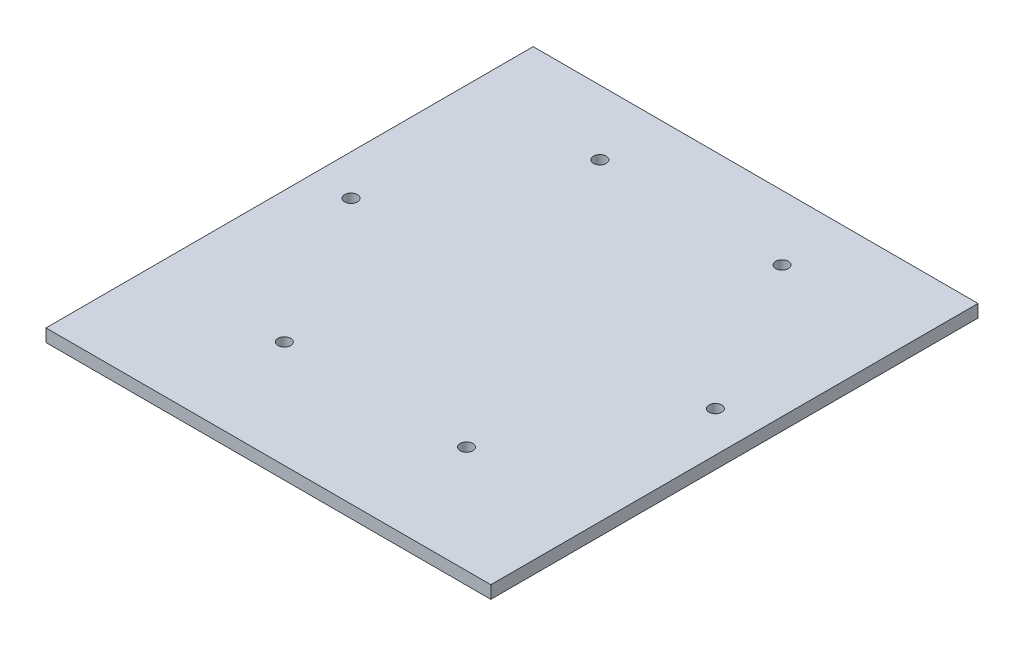
ISO-10303-21;
HEADER;
FILE_DESCRIPTION(('STEP AP214'),'2;1');
FILE_NAME('part.step','',(''),(''),'','','');
FILE_SCHEMA(('AUTOMOTIVE_DESIGN { 1 0 10303 214 1 1 1 1 }'));
ENDSEC;
DATA;
#1=APPLICATION_CONTEXT('core data for automotive mechanical design processes');
#2=APPLICATION_PROTOCOL_DEFINITION('international standard','automotive_design',2000,#1);
#3=PRODUCT_CONTEXT('',#1,'mechanical');
#4=PRODUCT('Part','Part','',(#3));
#5=PRODUCT_RELATED_PRODUCT_CATEGORY('part','',(#4));
#6=PRODUCT_DEFINITION_FORMATION('','',#4);
#7=PRODUCT_DEFINITION_CONTEXT('part definition',#1,'design');
#8=PRODUCT_DEFINITION('design','',#6,#7);
#9=PRODUCT_DEFINITION_SHAPE('','',#8);
#10=(LENGTH_UNIT() NAMED_UNIT(*) SI_UNIT(.MILLI.,.METRE.));
#11=(NAMED_UNIT(*) PLANE_ANGLE_UNIT() SI_UNIT($,.RADIAN.));
#12=(NAMED_UNIT(*) SI_UNIT($,.STERADIAN.) SOLID_ANGLE_UNIT());
#13=UNCERTAINTY_MEASURE_WITH_UNIT(LENGTH_MEASURE(1.E-05),#10,'distance_accuracy_value','');
#14=(GEOMETRIC_REPRESENTATION_CONTEXT(3) GLOBAL_UNCERTAINTY_ASSIGNED_CONTEXT((#13)) GLOBAL_UNIT_ASSIGNED_CONTEXT((#10,
#11,#12)) REPRESENTATION_CONTEXT('',''));
#15=CARTESIAN_POINT('',(0.,0.,0.));
#16=DIRECTION('',(0.,0.,1.));
#17=DIRECTION('',(1.,0.,0.));
#18=AXIS2_PLACEMENT_3D('',#15,#16,#17);
#19=CARTESIAN_POINT('',(0.,6.,0.));
#20=DIRECTION('',(0.,-1.,0.));
#21=DIRECTION('',(0.,0.,-1.));
#22=AXIS2_PLACEMENT_3D('',#19,#20,#21);
#23=PLANE('',#22);
#24=DIRECTION('',(0.,0.,1.));
#25=VECTOR('',#24,1.);
#26=CARTESIAN_POINT('',(0.,6.,0.));
#27=LINE('',#26,#25);
#28=CARTESIAN_POINT('',(0.,6.,-230.));
#29=VERTEX_POINT('',#28);
#30=CARTESIAN_POINT('',(0.,6.,0.));
#31=VERTEX_POINT('',#30);
#32=EDGE_CURVE('E84',#29,#31,#27,.T.);
#33=ORIENTED_EDGE('',*,*,#32,.T.);
#34=DIRECTION('',(1.,0.,0.));
#35=VECTOR('',#34,1.);
#36=CARTESIAN_POINT('',(0.,6.,0.));
#37=LINE('',#36,#35);
#38=CARTESIAN_POINT('',(210.,6.,0.));
#39=VERTEX_POINT('',#38);
#40=EDGE_CURVE('E79',#31,#39,#37,.T.);
#41=ORIENTED_EDGE('',*,*,#40,.T.);
#42=DIRECTION('',(0.,0.,-1.));
#43=VECTOR('',#42,1.);
#44=CARTESIAN_POINT('',(210.,6.,0.));
#45=LINE('',#44,#43);
#46=CARTESIAN_POINT('',(210.,6.,-230.));
#47=VERTEX_POINT('',#46);
#48=EDGE_CURVE('E82',#39,#47,#45,.T.);
#49=ORIENTED_EDGE('',*,*,#48,.T.);
#50=DIRECTION('',(-1.,0.,0.));
#51=VECTOR('',#50,1.);
#52=CARTESIAN_POINT('',(0.,6.,-230.));
#53=LINE('',#52,#51);
#54=EDGE_CURVE('E49',#47,#29,#53,.T.);
#55=ORIENTED_EDGE('',*,*,#54,.T.);
#56=EDGE_LOOP('',(#33,#41,#49,#55));
#57=FACE_BOUND('',#56,.T.);
#58=CARTESIAN_POINT('',(62.,6.,-199.478184725462));
#59=DIRECTION('',(0.,1.,0.));
#60=DIRECTION('',(0.,0.,1.));
#61=AXIS2_PLACEMENT_3D('',#58,#59,#60);
#62=CIRCLE('',#61,3.00000000000001);
#63=CARTESIAN_POINT('',(62.,6.,-196.478184725462));
#64=VERTEX_POINT('',#63);
#65=EDGE_CURVE('E99',#64,#64,#62,.T.);
#66=ORIENTED_EDGE('',*,*,#65,.F.);
#67=EDGE_LOOP('',(#66));
#68=FACE_BOUND('',#67,.T.);
#69=CARTESIAN_POINT('',(148.,6.,-199.478184725462));
#70=DIRECTION('',(0.,1.,0.));
#71=DIRECTION('',(0.,0.,1.));
#72=AXIS2_PLACEMENT_3D('',#69,#70,#71);
#73=CIRCLE('',#72,2.99999999999997);
#74=CARTESIAN_POINT('',(148.,6.,-196.478184725462));
#75=VERTEX_POINT('',#74);
#76=EDGE_CURVE('E114',#75,#75,#73,.T.);
#77=ORIENTED_EDGE('',*,*,#76,.F.);
#78=EDGE_LOOP('',(#77));
#79=FACE_BOUND('',#78,.T.);
#80=CARTESIAN_POINT('',(191.,6.,-125.));
#81=DIRECTION('',(0.,1.,0.));
#82=DIRECTION('',(0.,0.,1.));
#83=AXIS2_PLACEMENT_3D('',#80,#81,#82);
#84=CIRCLE('',#83,2.99999999999999);
#85=CARTESIAN_POINT('',(191.,6.,-122.));
#86=VERTEX_POINT('',#85);
#87=EDGE_CURVE('E120',#86,#86,#84,.T.);
#88=ORIENTED_EDGE('',*,*,#87,.F.);
#89=EDGE_LOOP('',(#88));
#90=FACE_BOUND('',#89,.T.);
#91=CARTESIAN_POINT('',(148.,6.,-50.5218152745383));
#92=DIRECTION('',(0.,1.,0.));
#93=DIRECTION('',(0.,0.,1.));
#94=AXIS2_PLACEMENT_3D('',#91,#92,#93);
#95=CIRCLE('',#94,2.99999999999999);
#96=CARTESIAN_POINT('',(148.,6.,-47.5218152745383));
#97=VERTEX_POINT('',#96);
#98=EDGE_CURVE('E126',#97,#97,#95,.T.);
#99=ORIENTED_EDGE('',*,*,#98,.F.);
#100=EDGE_LOOP('',(#99));
#101=FACE_BOUND('',#100,.T.);
#102=CARTESIAN_POINT('',(62.,6.,-50.5218152745383));
#103=DIRECTION('',(0.,1.,0.));
#104=DIRECTION('',(0.,0.,1.));
#105=AXIS2_PLACEMENT_3D('',#102,#103,#104);
#106=CIRCLE('',#105,2.99999999999999);
#107=CARTESIAN_POINT('',(62.,6.,-47.5218152745383));
#108=VERTEX_POINT('',#107);
#109=EDGE_CURVE('E132',#108,#108,#106,.T.);
#110=ORIENTED_EDGE('',*,*,#109,.F.);
#111=EDGE_LOOP('',(#110));
#112=FACE_BOUND('',#111,.T.);
#113=CARTESIAN_POINT('',(19.,6.,-125.));
#114=DIRECTION('',(0.,1.,0.));
#115=DIRECTION('',(0.,0.,1.));
#116=AXIS2_PLACEMENT_3D('',#113,#114,#115);
#117=CIRCLE('',#116,3.00000000000001);
#118=CARTESIAN_POINT('',(19.,6.,-122.));
#119=VERTEX_POINT('',#118);
#120=EDGE_CURVE('E138',#119,#119,#117,.T.);
#121=ORIENTED_EDGE('',*,*,#120,.F.);
#122=EDGE_LOOP('',(#121));
#123=FACE_BOUND('',#122,.T.);
#124=ADVANCED_FACE('F32',(#57,#68,#79,#90,#101,#112,#123),#23,.F.);
#125=CARTESIAN_POINT('',(0.,0.,0.));
#126=DIRECTION('',(0.,-1.,0.));
#127=DIRECTION('',(0.,0.,-1.));
#128=AXIS2_PLACEMENT_3D('',#125,#126,#127);
#129=PLANE('',#128);
#130=CARTESIAN_POINT('',(62.,0.,-50.5218152745383));
#131=DIRECTION('',(0.,1.,0.));
#132=DIRECTION('',(0.,0.,1.));
#133=AXIS2_PLACEMENT_3D('',#130,#131,#132);
#134=CIRCLE('',#133,2.99999999999999);
#135=CARTESIAN_POINT('',(62.,0.,-47.5218152745383));
#136=VERTEX_POINT('',#135);
#137=EDGE_CURVE('E135',#136,#136,#134,.T.);
#138=ORIENTED_EDGE('',*,*,#137,.T.);
#139=EDGE_LOOP('',(#138));
#140=FACE_BOUND('',#139,.T.);
#141=CARTESIAN_POINT('',(191.,0.,-125.));
#142=DIRECTION('',(0.,1.,0.));
#143=DIRECTION('',(0.,0.,1.));
#144=AXIS2_PLACEMENT_3D('',#141,#142,#143);
#145=CIRCLE('',#144,2.99999999999999);
#146=CARTESIAN_POINT('',(191.,0.,-122.));
#147=VERTEX_POINT('',#146);
#148=EDGE_CURVE('E123',#147,#147,#145,.T.);
#149=ORIENTED_EDGE('',*,*,#148,.T.);
#150=EDGE_LOOP('',(#149));
#151=FACE_BOUND('',#150,.T.);
#152=CARTESIAN_POINT('',(62.,0.,-199.478184725462));
#153=DIRECTION('',(0.,1.,0.));
#154=DIRECTION('',(0.,0.,1.));
#155=AXIS2_PLACEMENT_3D('',#152,#153,#154);
#156=CIRCLE('',#155,3.00000000000001);
#157=CARTESIAN_POINT('',(62.,0.,-196.478184725462));
#158=VERTEX_POINT('',#157);
#159=EDGE_CURVE('E111',#158,#158,#156,.T.);
#160=ORIENTED_EDGE('',*,*,#159,.T.);
#161=EDGE_LOOP('',(#160));
#162=FACE_BOUND('',#161,.T.);
#163=DIRECTION('',(0.,0.,1.));
#164=VECTOR('',#163,1.);
#165=CARTESIAN_POINT('',(0.,0.,0.));
#166=LINE('',#165,#164);
#167=CARTESIAN_POINT('',(0.,0.,-230.));
#168=VERTEX_POINT('',#167);
#169=CARTESIAN_POINT('',(0.,0.,0.));
#170=VERTEX_POINT('',#169);
#171=EDGE_CURVE('E96',#168,#170,#166,.T.);
#172=ORIENTED_EDGE('',*,*,#171,.F.);
#173=DIRECTION('',(-1.,0.,0.));
#174=VECTOR('',#173,1.);
#175=CARTESIAN_POINT('',(0.,0.,-230.));
#176=LINE('',#175,#174);
#177=CARTESIAN_POINT('',(210.,0.,-230.));
#178=VERTEX_POINT('',#177);
#179=EDGE_CURVE('E72',#178,#168,#176,.T.);
#180=ORIENTED_EDGE('',*,*,#179,.F.);
#181=DIRECTION('',(0.,0.,-1.));
#182=VECTOR('',#181,1.);
#183=CARTESIAN_POINT('',(210.,0.,0.));
#184=LINE('',#183,#182);
#185=CARTESIAN_POINT('',(210.,0.,0.));
#186=VERTEX_POINT('',#185);
#187=EDGE_CURVE('E66',#186,#178,#184,.T.);
#188=ORIENTED_EDGE('',*,*,#187,.F.);
#189=DIRECTION('',(1.,0.,0.));
#190=VECTOR('',#189,1.);
#191=CARTESIAN_POINT('',(0.,0.,0.));
#192=LINE('',#191,#190);
#193=EDGE_CURVE('E88',#170,#186,#192,.T.);
#194=ORIENTED_EDGE('',*,*,#193,.F.);
#195=EDGE_LOOP('',(#172,#180,#188,#194));
#196=FACE_BOUND('',#195,.T.);
#197=CARTESIAN_POINT('',(148.,0.,-199.478184725462));
#198=DIRECTION('',(0.,1.,0.));
#199=DIRECTION('',(0.,0.,1.));
#200=AXIS2_PLACEMENT_3D('',#197,#198,#199);
#201=CIRCLE('',#200,2.99999999999997);
#202=CARTESIAN_POINT('',(148.,0.,-196.478184725462));
#203=VERTEX_POINT('',#202);
#204=EDGE_CURVE('E117',#203,#203,#201,.T.);
#205=ORIENTED_EDGE('',*,*,#204,.T.);
#206=EDGE_LOOP('',(#205));
#207=FACE_BOUND('',#206,.T.);
#208=CARTESIAN_POINT('',(148.,0.,-50.5218152745383));
#209=DIRECTION('',(0.,1.,0.));
#210=DIRECTION('',(0.,0.,1.));
#211=AXIS2_PLACEMENT_3D('',#208,#209,#210);
#212=CIRCLE('',#211,2.99999999999999);
#213=CARTESIAN_POINT('',(148.,0.,-47.5218152745383));
#214=VERTEX_POINT('',#213);
#215=EDGE_CURVE('E129',#214,#214,#212,.T.);
#216=ORIENTED_EDGE('',*,*,#215,.T.);
#217=EDGE_LOOP('',(#216));
#218=FACE_BOUND('',#217,.T.);
#219=CARTESIAN_POINT('',(19.,0.,-125.));
#220=DIRECTION('',(0.,1.,0.));
#221=DIRECTION('',(0.,0.,1.));
#222=AXIS2_PLACEMENT_3D('',#219,#220,#221);
#223=CIRCLE('',#222,3.00000000000001);
#224=CARTESIAN_POINT('',(19.,0.,-122.));
#225=VERTEX_POINT('',#224);
#226=EDGE_CURVE('E141',#225,#225,#223,.T.);
#227=ORIENTED_EDGE('',*,*,#226,.T.);
#228=EDGE_LOOP('',(#227));
#229=FACE_BOUND('',#228,.T.);
#230=ADVANCED_FACE('F107',(#140,#151,#162,#196,#207,#218,#229),#129,.T.);
#231=CARTESIAN_POINT('',(0.,6.,0.));
#232=DIRECTION('',(1.,0.,0.));
#233=DIRECTION('',(0.,0.,-1.));
#234=AXIS2_PLACEMENT_3D('',#231,#232,#233);
#235=PLANE('',#234);
#236=ORIENTED_EDGE('',*,*,#171,.T.);
#237=DIRECTION('',(0.,-1.,0.));
#238=VECTOR('',#237,1.);
#239=CARTESIAN_POINT('',(0.,6.,0.));
#240=LINE('',#239,#238);
#241=EDGE_CURVE('E11',#31,#170,#240,.T.);
#242=ORIENTED_EDGE('',*,*,#241,.F.);
#243=ORIENTED_EDGE('',*,*,#32,.F.);
#244=DIRECTION('',(0.,-1.,0.));
#245=VECTOR('',#244,1.);
#246=CARTESIAN_POINT('',(0.,6.,-230.));
#247=LINE('',#246,#245);
#248=EDGE_CURVE('E92',#29,#168,#247,.T.);
#249=ORIENTED_EDGE('',*,*,#248,.T.);
#250=EDGE_LOOP('',(#236,#242,#243,#249));
#251=FACE_BOUND('',#250,.T.);
#252=ADVANCED_FACE('F34',(#251),#235,.F.);
#253=CARTESIAN_POINT('',(0.,6.,0.));
#254=DIRECTION('',(0.,0.,-1.));
#255=DIRECTION('',(-1.,0.,0.));
#256=AXIS2_PLACEMENT_3D('',#253,#254,#255);
#257=PLANE('',#256);
#258=ORIENTED_EDGE('',*,*,#193,.T.);
#259=DIRECTION('',(0.,-1.,0.));
#260=VECTOR('',#259,1.);
#261=CARTESIAN_POINT('',(210.,6.,0.));
#262=LINE('',#261,#260);
#263=EDGE_CURVE('E41',#39,#186,#262,.T.);
#264=ORIENTED_EDGE('',*,*,#263,.F.);
#265=ORIENTED_EDGE('',*,*,#40,.F.);
#266=ORIENTED_EDGE('',*,*,#241,.T.);
#267=EDGE_LOOP('',(#258,#264,#265,#266));
#268=FACE_BOUND('',#267,.T.);
#269=ADVANCED_FACE('F87',(#268),#257,.F.);
#270=CARTESIAN_POINT('',(210.,6.,0.));
#271=DIRECTION('',(-1.,0.,0.));
#272=DIRECTION('',(0.,0.,1.));
#273=AXIS2_PLACEMENT_3D('',#270,#271,#272);
#274=PLANE('',#273);
#275=ORIENTED_EDGE('',*,*,#187,.T.);
#276=DIRECTION('',(0.,-1.,0.));
#277=VECTOR('',#276,1.);
#278=CARTESIAN_POINT('',(210.,6.,-230.));
#279=LINE('',#278,#277);
#280=EDGE_CURVE('E89',#47,#178,#279,.T.);
#281=ORIENTED_EDGE('',*,*,#280,.F.);
#282=ORIENTED_EDGE('',*,*,#48,.F.);
#283=ORIENTED_EDGE('',*,*,#263,.T.);
#284=EDGE_LOOP('',(#275,#281,#282,#283));
#285=FACE_BOUND('',#284,.T.);
#286=ADVANCED_FACE('F90',(#285),#274,.F.);
#287=CARTESIAN_POINT('',(0.,6.,-230.));
#288=DIRECTION('',(0.,0.,1.));
#289=DIRECTION('',(1.,0.,0.));
#290=AXIS2_PLACEMENT_3D('',#287,#288,#289);
#291=PLANE('',#290);
#292=ORIENTED_EDGE('',*,*,#179,.T.);
#293=ORIENTED_EDGE('',*,*,#248,.F.);
#294=ORIENTED_EDGE('',*,*,#54,.F.);
#295=ORIENTED_EDGE('',*,*,#280,.T.);
#296=EDGE_LOOP('',(#292,#293,#294,#295));
#297=FACE_BOUND('',#296,.T.);
#298=ADVANCED_FACE('F104',(#297),#291,.F.);
#299=CARTESIAN_POINT('',(62.,6.,-199.478184725462));
#300=DIRECTION('',(0.,-1.,0.));
#301=DIRECTION('',(0.,0.,-1.));
#302=AXIS2_PLACEMENT_3D('',#299,#300,#301);
#303=CYLINDRICAL_SURFACE('',#302,3.00000000000001);
#304=ORIENTED_EDGE('',*,*,#65,.T.);
#305=EDGE_LOOP('',(#304));
#306=FACE_BOUND('',#305,.T.);
#307=ORIENTED_EDGE('',*,*,#159,.F.);
#308=EDGE_LOOP('',(#307));
#309=FACE_BOUND('',#308,.T.);
#310=ADVANCED_FACE('F158',(#306,#309),#303,.F.);
#311=CARTESIAN_POINT('',(148.,6.,-199.478184725462));
#312=DIRECTION('',(0.,-1.,0.));
#313=DIRECTION('',(0.,0.,-1.));
#314=AXIS2_PLACEMENT_3D('',#311,#312,#313);
#315=CYLINDRICAL_SURFACE('',#314,2.99999999999997);
#316=ORIENTED_EDGE('',*,*,#76,.T.);
#317=EDGE_LOOP('',(#316));
#318=FACE_BOUND('',#317,.T.);
#319=ORIENTED_EDGE('',*,*,#204,.F.);
#320=EDGE_LOOP('',(#319));
#321=FACE_BOUND('',#320,.T.);
#322=ADVANCED_FACE('F204',(#318,#321),#315,.F.);
#323=CARTESIAN_POINT('',(191.,6.,-125.));
#324=DIRECTION('',(0.,-1.,0.));
#325=DIRECTION('',(0.,0.,-1.));
#326=AXIS2_PLACEMENT_3D('',#323,#324,#325);
#327=CYLINDRICAL_SURFACE('',#326,2.99999999999999);
#328=ORIENTED_EDGE('',*,*,#87,.T.);
#329=EDGE_LOOP('',(#328));
#330=FACE_BOUND('',#329,.T.);
#331=ORIENTED_EDGE('',*,*,#148,.F.);
#332=EDGE_LOOP('',(#331));
#333=FACE_BOUND('',#332,.T.);
#334=ADVANCED_FACE('F212',(#330,#333),#327,.F.);
#335=CARTESIAN_POINT('',(148.,6.,-50.5218152745383));
#336=DIRECTION('',(0.,-1.,0.));
#337=DIRECTION('',(0.,0.,-1.));
#338=AXIS2_PLACEMENT_3D('',#335,#336,#337);
#339=CYLINDRICAL_SURFACE('',#338,2.99999999999999);
#340=ORIENTED_EDGE('',*,*,#98,.T.);
#341=EDGE_LOOP('',(#340));
#342=FACE_BOUND('',#341,.T.);
#343=ORIENTED_EDGE('',*,*,#215,.F.);
#344=EDGE_LOOP('',(#343));
#345=FACE_BOUND('',#344,.T.);
#346=ADVANCED_FACE('F220',(#342,#345),#339,.F.);
#347=CARTESIAN_POINT('',(62.,6.,-50.5218152745383));
#348=DIRECTION('',(0.,-1.,0.));
#349=DIRECTION('',(0.,0.,-1.));
#350=AXIS2_PLACEMENT_3D('',#347,#348,#349);
#351=CYLINDRICAL_SURFACE('',#350,2.99999999999999);
#352=ORIENTED_EDGE('',*,*,#109,.T.);
#353=EDGE_LOOP('',(#352));
#354=FACE_BOUND('',#353,.T.);
#355=ORIENTED_EDGE('',*,*,#137,.F.);
#356=EDGE_LOOP('',(#355));
#357=FACE_BOUND('',#356,.T.);
#358=ADVANCED_FACE('F229',(#354,#357),#351,.F.);
#359=CARTESIAN_POINT('',(19.,6.,-125.));
#360=DIRECTION('',(0.,-1.,0.));
#361=DIRECTION('',(0.,0.,-1.));
#362=AXIS2_PLACEMENT_3D('',#359,#360,#361);
#363=CYLINDRICAL_SURFACE('',#362,3.00000000000001);
#364=ORIENTED_EDGE('',*,*,#120,.T.);
#365=EDGE_LOOP('',(#364));
#366=FACE_BOUND('',#365,.T.);
#367=ORIENTED_EDGE('',*,*,#226,.F.);
#368=EDGE_LOOP('',(#367));
#369=FACE_BOUND('',#368,.T.);
#370=ADVANCED_FACE('F147',(#366,#369),#363,.F.);
#371=CLOSED_SHELL('',(#124,#230,#252,#269,#286,#298,#310,#322,#334,#346,#358,#370));
#372=MANIFOLD_SOLID_BREP('B2',#371);
#373=ADVANCED_BREP_SHAPE_REPRESENTATION('',(#18,#372),#14);
#374=SHAPE_DEFINITION_REPRESENTATION(#9,#373);
ENDSEC;
END-ISO-10303-21;
